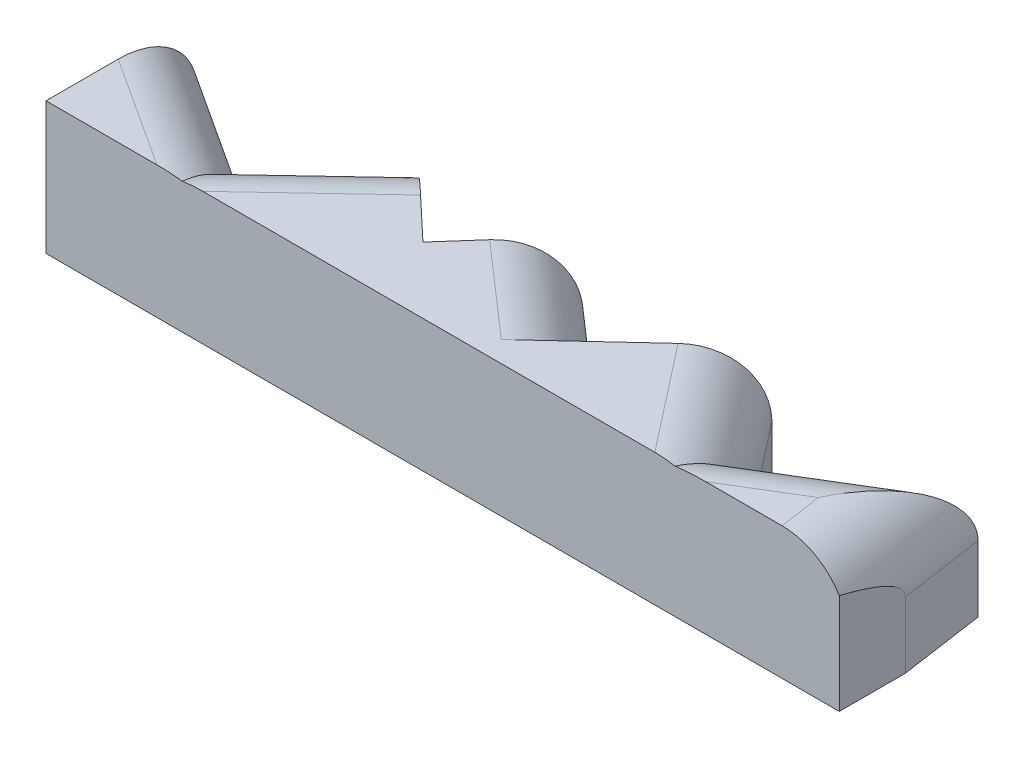
ISO-10303-21;
HEADER;
FILE_DESCRIPTION(('STEP AP214'),'2;1');
FILE_NAME('part.step','',(''),(''),'','','');
FILE_SCHEMA(('AUTOMOTIVE_DESIGN { 1 0 10303 214 1 1 1 1 }'));
ENDSEC;
DATA;
#1=APPLICATION_CONTEXT('core data for automotive mechanical design processes');
#2=APPLICATION_PROTOCOL_DEFINITION('international standard','automotive_design',2000,#1);
#3=PRODUCT_CONTEXT('',#1,'mechanical');
#4=PRODUCT('Part','Part','',(#3));
#5=PRODUCT_RELATED_PRODUCT_CATEGORY('part','',(#4));
#6=PRODUCT_DEFINITION_FORMATION('','',#4);
#7=PRODUCT_DEFINITION_CONTEXT('part definition',#1,'design');
#8=PRODUCT_DEFINITION('design','',#6,#7);
#9=PRODUCT_DEFINITION_SHAPE('','',#8);
#10=(LENGTH_UNIT() NAMED_UNIT(*) SI_UNIT(.MILLI.,.METRE.));
#11=(NAMED_UNIT(*) PLANE_ANGLE_UNIT() SI_UNIT($,.RADIAN.));
#12=(NAMED_UNIT(*) SI_UNIT($,.STERADIAN.) SOLID_ANGLE_UNIT());
#13=UNCERTAINTY_MEASURE_WITH_UNIT(LENGTH_MEASURE(1.E-05),#10,'distance_accuracy_value','');
#14=(GEOMETRIC_REPRESENTATION_CONTEXT(3) GLOBAL_UNCERTAINTY_ASSIGNED_CONTEXT((#13)) GLOBAL_UNIT_ASSIGNED_CONTEXT((#10,
#11,#12)) REPRESENTATION_CONTEXT('',''));
#15=CARTESIAN_POINT('',(0.,0.,0.));
#16=DIRECTION('',(0.,0.,1.));
#17=DIRECTION('',(1.,0.,0.));
#18=AXIS2_PLACEMENT_3D('',#15,#16,#17);
#19=CARTESIAN_POINT('',(0.,129.522150417628,0.));
#20=DIRECTION('',(0.,-1.,0.));
#21=DIRECTION('',(0.,0.,-1.));
#22=AXIS2_PLACEMENT_3D('',#19,#20,#21);
#23=PLANE('',#22);
#24=DIRECTION('',(1.,0.,0.));
#25=VECTOR('',#24,1.);
#26=CARTESIAN_POINT('',(-32.3481367773547,129.522150417628,19.2762862056775));
#27=LINE('',#26,#25);
#28=CARTESIAN_POINT('',(-32.3481367773547,129.522150417628,19.2762862056775));
#29=VERTEX_POINT('',#28);
#30=CARTESIAN_POINT('',(-11.0387420261043,129.522150417628,19.2762862056775));
#31=VERTEX_POINT('',#30);
#32=EDGE_CURVE('E240',#29,#31,#27,.T.);
#33=ORIENTED_EDGE('',*,*,#32,.T.);
#34=DIRECTION('',(-0.838034932453273,0.,-0.54561657964915));
#35=VECTOR('',#34,1.);
#36=CARTESIAN_POINT('',(-39.2774673388989,129.522150417628,0.890994468834512));
#37=LINE('',#36,#35);
#38=CARTESIAN_POINT('',(-32.3481367773547,129.522150417628,5.40245036862647));
#39=VERTEX_POINT('',#38);
#40=EDGE_CURVE('E267',#31,#39,#37,.T.);
#41=ORIENTED_EDGE('',*,*,#40,.T.);
#42=DIRECTION('',(0.,0.,1.));
#43=VECTOR('',#42,1.);
#44=CARTESIAN_POINT('',(-32.3481367773547,129.522150417628,19.2762862056775));
#45=LINE('',#44,#43);
#46=EDGE_CURVE('E185',#39,#29,#45,.T.);
#47=ORIENTED_EDGE('',*,*,#46,.T.);
#48=EDGE_LOOP('',(#33,#41,#47));
#49=FACE_BOUND('',#48,.T.);
#50=ADVANCED_FACE('F34',(#49),#23,.F.);
#51=CARTESIAN_POINT('',(94.3752872082478,129.522150417628,19.2762862056775));
#52=VERTEX_POINT('',#51);
#53=CARTESIAN_POINT('',(109.06426888178,129.522150417628,19.2762862056775));
#54=VERTEX_POINT('',#53);
#55=EDGE_CURVE('E244',#52,#54,#27,.T.);
#56=ORIENTED_EDGE('',*,*,#55,.T.);
#57=DIRECTION('',(-0.143830824403792,0.,-0.989602290797331));
#58=VECTOR('',#57,1.);
#59=CARTESIAN_POINT('',(105.110720412667,129.522150417628,-7.9253977033939));
#60=LINE('',#59,#58);
#61=CARTESIAN_POINT('',(107.871821895293,129.522150417628,11.0718677552231));
#62=VERTEX_POINT('',#61);
#63=EDGE_CURVE('E262',#54,#62,#60,.T.);
#64=ORIENTED_EDGE('',*,*,#63,.T.);
#65=DIRECTION('',(-0.854503886737945,0.,0.519444999542536));
#66=VECTOR('',#65,1.);
#67=CARTESIAN_POINT('',(97.414979242716,129.522150417628,17.4284855672494));
#68=LINE('',#67,#66);
#69=EDGE_CURVE('E260',#62,#52,#68,.T.);
#70=ORIENTED_EDGE('',*,*,#69,.T.);
#71=EDGE_LOOP('',(#56,#64,#70));
#72=FACE_BOUND('',#71,.T.);
#73=ADVANCED_FACE('F332',(#72),#23,.F.);
#74=CARTESIAN_POINT('',(-32.3481367773547,104.122150417628,247.876286205677));
#75=DIRECTION('',(0.,-1.,0.));
#76=DIRECTION('',(0.,0.,-1.));
#77=AXIS2_PLACEMENT_3D('',#74,#75,#76);
#78=PLANE('',#77);
#79=DIRECTION('',(1.,0.,0.));
#80=VECTOR('',#79,1.);
#81=CARTESIAN_POINT('',(-32.3481367773547,104.122150417628,19.2762862056775));
#82=LINE('',#81,#80);
#83=CARTESIAN_POINT('',(-32.3481367773547,104.122150417628,19.2762862056775));
#84=VERTEX_POINT('',#83);
#85=CARTESIAN_POINT('',(120.051863222645,104.122150417628,19.2762862056775));
#86=VERTEX_POINT('',#85);
#87=EDGE_CURVE('E171',#84,#86,#82,.T.);
#88=ORIENTED_EDGE('',*,*,#87,.F.);
#89=DIRECTION('',(0.,0.,1.));
#90=VECTOR('',#89,1.);
#91=CARTESIAN_POINT('',(-32.3481367773547,104.122150417628,19.2762862056775));
#92=LINE('',#91,#90);
#93=CARTESIAN_POINT('',(-32.3481367773547,104.122150417628,-9.75204917332207));
#94=VERTEX_POINT('',#93);
#95=EDGE_CURVE('E164',#94,#84,#92,.T.);
#96=ORIENTED_EDGE('',*,*,#95,.F.);
#97=DIRECTION('',(-0.838034932453273,0.,-0.54561657964915));
#98=VECTOR('',#97,1.);
#99=CARTESIAN_POINT('',(-32.3481367773547,104.122150417628,-9.75204917332206));
#100=LINE('',#99,#98);
#101=CARTESIAN_POINT('',(-7.26877528651925,104.122150417628,6.57628620567745));
#102=VERTEX_POINT('',#101);
#103=EDGE_CURVE('E168',#102,#94,#100,.T.);
#104=ORIENTED_EDGE('',*,*,#103,.F.);
#105=DIRECTION('',(-0.727757972532606,0.,0.685834042181657));
#106=VECTOR('',#105,1.);
#107=CARTESIAN_POINT('',(-7.26877528651926,104.122150417628,6.57628620567745));
#108=LINE('',#107,#106);
#109=CARTESIAN_POINT('',(10.0576849347505,104.122150417628,-9.75204917332206));
#110=VERTEX_POINT('',#109);
#111=EDGE_CURVE('E192',#110,#102,#108,.T.);
#112=ORIENTED_EDGE('',*,*,#111,.F.);
#113=DIRECTION('',(-0.727481315917903,0.,-0.686127491790233));
#114=VECTOR('',#113,1.);
#115=CARTESIAN_POINT('',(10.0576849347505,104.122150417628,-9.75204917332206));
#116=LINE('',#115,#114);
#117=CARTESIAN_POINT('',(27.3701509857318,104.122150417628,6.57628620567745));
#118=VERTEX_POINT('',#117);
#119=EDGE_CURVE('E200',#118,#110,#116,.T.);
#120=ORIENTED_EDGE('',*,*,#119,.F.);
#121=DIRECTION('',(-0.661958734624775,0.,0.749540281541938));
#122=VECTOR('',#121,1.);
#123=CARTESIAN_POINT('',(27.3701509857318,104.122150417628,6.57628620567745));
#124=LINE('',#123,#122);
#125=CARTESIAN_POINT('',(41.7905690635649,104.122150417628,-9.75204917332207));
#126=VERTEX_POINT('',#125);
#127=EDGE_CURVE('E204',#126,#118,#124,.T.);
#128=ORIENTED_EDGE('',*,*,#127,.F.);
#129=DIRECTION('',(-0.752940248667759,0.,-0.658088886045141));
#130=VECTOR('',#129,1.);
#131=CARTESIAN_POINT('',(41.7905690635649,104.122150417628,-9.75204917332206));
#132=LINE('',#131,#130);
#133=CARTESIAN_POINT('',(60.4723325172501,104.122150417628,6.57628620567745));
#134=VERTEX_POINT('',#133);
#135=EDGE_CURVE('E208',#134,#126,#132,.T.);
#136=ORIENTED_EDGE('',*,*,#135,.F.);
#137=DIRECTION('',(-0.73322275073973,0.,0.679988527695625));
#138=VECTOR('',#137,1.);
#139=CARTESIAN_POINT('',(60.47233251725,104.122150417628,6.57628620567745));
#140=LINE('',#139,#138);
#141=CARTESIAN_POINT('',(78.0789633558072,104.122150417628,-9.75204917332206));
#142=VERTEX_POINT('',#141);
#143=EDGE_CURVE('E212',#142,#134,#140,.T.);
#144=ORIENTED_EDGE('',*,*,#143,.F.);
#145=DIRECTION('',(-0.61512074165381,0.,-0.788432922439992));
#146=VECTOR('',#145,1.);
#147=CARTESIAN_POINT('',(78.0789633558072,104.122150417628,-9.75204917332206));
#148=LINE('',#147,#146);
#149=CARTESIAN_POINT('',(90.8180277485258,104.122150417628,6.57628620567745));
#150=VERTEX_POINT('',#149);
#151=EDGE_CURVE('E216',#150,#142,#148,.T.);
#152=ORIENTED_EDGE('',*,*,#151,.F.);
#153=DIRECTION('',(-0.854503886737945,0.,0.519444999542536));
#154=VECTOR('',#153,1.);
#155=CARTESIAN_POINT('',(90.8180277485258,104.122150417628,6.57628620567745));
#156=LINE('',#155,#154);
#157=CARTESIAN_POINT('',(117.678669505793,104.122150417628,-9.75204917332206));
#158=VERTEX_POINT('',#157);
#159=EDGE_CURVE('E220',#158,#150,#156,.T.);
#160=ORIENTED_EDGE('',*,*,#159,.F.);
#161=DIRECTION('',(-0.143830824403792,0.,-0.989602290797331));
#162=VECTOR('',#161,1.);
#163=CARTESIAN_POINT('',(117.678669505793,104.122150417628,-9.75204917332206));
#164=LINE('',#163,#162);
#165=CARTESIAN_POINT('',(120.051863222645,104.122150417628,6.57628620567745));
#166=VERTEX_POINT('',#165);
#167=EDGE_CURVE('E224',#166,#158,#164,.T.);
#168=ORIENTED_EDGE('',*,*,#167,.F.);
#169=DIRECTION('',(0.,0.,-1.));
#170=VECTOR('',#169,1.);
#171=CARTESIAN_POINT('',(120.051863222645,104.122150417628,19.2762862056775));
#172=LINE('',#171,#170);
#173=EDGE_CURVE('E248',#86,#166,#172,.T.);
#174=ORIENTED_EDGE('',*,*,#173,.F.);
#175=EDGE_LOOP('',(#88,#96,#104,#112,#120,#128,#136,#144,#152,#160,#168,#174));
#176=FACE_BOUND('',#175,.T.);
#177=ADVANCED_FACE('F166',(#176),#78,.T.);
#178=DIRECTION('',(-0.727481315917903,0.,-0.686127491790233));
#179=VECTOR('',#178,1.);
#180=CARTESIAN_POINT('',(10.0576849347505,129.522150417628,-9.75204917332206));
#181=LINE('',#180,#179);
#182=CARTESIAN_POINT('',(27.3701509857318,129.522150417628,6.57628620567745));
#183=VERTEX_POINT('',#182);
#184=CARTESIAN_POINT('',(19.3127440329091,129.522150417628,-1.0230958016775));
#185=VERTEX_POINT('',#184);
#186=EDGE_CURVE('E226',#183,#185,#181,.T.);
#187=ORIENTED_EDGE('',*,*,#186,.T.);
#188=DIRECTION('',(-0.727757972532606,0.,0.685834042181657));
#189=VECTOR('',#188,1.);
#190=CARTESIAN_POINT('',(1.44131704918779,129.522150417628,15.8188124568415));
#191=LINE('',#190,#189);
#192=CARTESIAN_POINT('',(-2.22750650108892,129.522150417628,19.2762862056775));
#193=VERTEX_POINT('',#192);
#194=EDGE_CURVE('E265',#185,#193,#191,.T.);
#195=ORIENTED_EDGE('',*,*,#194,.T.);
#196=CARTESIAN_POINT('',(84.6184304944313,129.522150417628,19.2762862056775));
#197=VERTEX_POINT('',#196);
#198=EDGE_CURVE('E243',#193,#197,#27,.T.);
#199=ORIENTED_EDGE('',*,*,#198,.T.);
#200=DIRECTION('',(-0.61512074165381,0.,-0.788432922439992));
#201=VECTOR('',#200,1.);
#202=CARTESIAN_POINT('',(68.0658652408193,129.522150417628,-1.94001575431866));
#203=LINE('',#202,#201);
#204=CARTESIAN_POINT('',(68.7331277638799,129.522150417628,-1.08474994150127));
#205=VERTEX_POINT('',#204);
#206=EDGE_CURVE('E258',#197,#205,#203,.T.);
#207=ORIENTED_EDGE('',*,*,#206,.T.);
#208=DIRECTION('',(-0.73322275073973,0.,0.679988527695625));
#209=VECTOR('',#208,1.);
#210=CARTESIAN_POINT('',(60.47233251725,129.522150417628,6.57628620567745));
#211=LINE('',#210,#209);
#212=CARTESIAN_POINT('',(51.109059837337,129.522150417628,15.2597565393561));
#213=VERTEX_POINT('',#212);
#214=EDGE_CURVE('E196',#205,#213,#211,.T.);
#215=ORIENTED_EDGE('',*,*,#214,.T.);
#216=DIRECTION('',(-0.752940248667759,0.,-0.658088886045141));
#217=VECTOR('',#216,1.);
#218=CARTESIAN_POINT('',(33.4328402107916,129.522150417628,-0.18970801524153));
#219=LINE('',#218,#217);
#220=CARTESIAN_POINT('',(33.3835815920034,129.522150417628,-0.232761298186398));
#221=VERTEX_POINT('',#220);
#222=EDGE_CURVE('E255',#213,#221,#219,.T.);
#223=ORIENTED_EDGE('',*,*,#222,.T.);
#224=DIRECTION('',(-0.661958734624775,0.,0.749540281541938));
#225=VECTOR('',#224,1.);
#226=CARTESIAN_POINT('',(27.3701509857318,129.522150417628,6.57628620567745));
#227=LINE('',#226,#225);
#228=EDGE_CURVE('E354',#221,#183,#227,.T.);
#229=ORIENTED_EDGE('',*,*,#228,.T.);
#230=EDGE_LOOP('',(#187,#195,#199,#207,#215,#223,#229));
#231=FACE_BOUND('',#230,.T.);
#232=ADVANCED_FACE('F327',(#231),#23,.F.);
#233=CARTESIAN_POINT('',(-32.3481367773547,-48.8061007330347,19.2762862056775));
#234=DIRECTION('',(0.,0.,1.));
#235=DIRECTION('',(1.,0.,0.));
#236=AXIS2_PLACEMENT_3D('',#233,#234,#235);
#237=PLANE('',#236);
#238=CARTESIAN_POINT('',(-2.22750650108891,116.822150417628,19.2762862056775));
#239=DIRECTION('',(0.,0.,1.));
#240=DIRECTION('',(1.,0.,0.));
#241=AXIS2_PLACEMENT_3D('',#238,#239,#240);
#242=ELLIPSE('',#241,18.5175993300084,12.7);
#243=CARTESIAN_POINT('',(-6.1314845448813,129.236702172233,19.2762862056775));
#244=VERTEX_POINT('',#243);
#245=EDGE_CURVE('E279',#193,#244,#242,.T.);
#246=ORIENTED_EDGE('',*,*,#245,.T.);
#247=CARTESIAN_POINT('',(-11.0387420261043,116.822150417628,19.2762862056775));
#248=DIRECTION('',(0.,0.,1.));
#249=DIRECTION('',(1.,0.,0.));
#250=AXIS2_PLACEMENT_3D('',#247,#248,#249);
#251=ELLIPSE('',#250,23.2764187777551,12.7);
#252=EDGE_CURVE('E281',#244,#31,#251,.T.);
#253=ORIENTED_EDGE('',*,*,#252,.T.);
#254=ORIENTED_EDGE('',*,*,#32,.F.);
#255=DIRECTION('',(0.,1.,0.));
#256=VECTOR('',#255,1.);
#257=CARTESIAN_POINT('',(-32.3481367773547,-48.8061007330347,19.2762862056775));
#258=LINE('',#257,#256);
#259=EDGE_CURVE('E175',#84,#29,#258,.T.);
#260=ORIENTED_EDGE('',*,*,#259,.F.);
#261=ORIENTED_EDGE('',*,*,#87,.T.);
#262=DIRECTION('',(0.,1.,0.));
#263=VECTOR('',#262,1.);
#264=CARTESIAN_POINT('',(120.051863222645,-48.8061007330347,19.2762862056775));
#265=LINE('',#264,#263);
#266=CARTESIAN_POINT('',(120.051863222645,123.384184533935,19.2762862056775));
#267=VERTEX_POINT('',#266);
#268=EDGE_CURVE('E246',#86,#267,#265,.T.);
#269=ORIENTED_EDGE('',*,*,#268,.T.);
#270=CARTESIAN_POINT('',(109.06426888178,116.822150417628,19.2762862056774));
#271=DIRECTION('',(0.,0.,1.));
#272=DIRECTION('',(1.,0.,0.));
#273=AXIS2_PLACEMENT_3D('',#270,#271,#272);
#274=ELLIPSE('',#273,12.8334383601391,12.7);
#275=EDGE_CURVE('E277',#267,#54,#274,.T.);
#276=ORIENTED_EDGE('',*,*,#275,.T.);
#277=ORIENTED_EDGE('',*,*,#55,.F.);
#278=CARTESIAN_POINT('',(94.375287208248,116.822150417628,19.2762862056775));
#279=DIRECTION('',(0.,0.,1.));
#280=DIRECTION('',(1.,0.,0.));
#281=AXIS2_PLACEMENT_3D('',#278,#279,#280);
#282=ELLIPSE('',#281,24.4491717336477,12.7);
#283=CARTESIAN_POINT('',(88.4935249096369,129.149170946848,19.2762862056775));
#284=VERTEX_POINT('',#283);
#285=EDGE_CURVE('E275',#52,#284,#282,.T.);
#286=ORIENTED_EDGE('',*,*,#285,.T.);
#287=CARTESIAN_POINT('',(84.6184304944313,116.822150417628,19.2762862056775));
#288=DIRECTION('',(0.,0.,1.));
#289=DIRECTION('',(1.,0.,0.));
#290=AXIS2_PLACEMENT_3D('',#287,#288,#289);
#291=ELLIPSE('',#290,16.1079016851514,12.7);
#292=EDGE_CURVE('E273',#284,#197,#291,.T.);
#293=ORIENTED_EDGE('',*,*,#292,.T.);
#294=ORIENTED_EDGE('',*,*,#198,.F.);
#295=EDGE_LOOP('',(#246,#253,#254,#260,#261,#269,#276,#277,#286,#293,#294));
#296=FACE_BOUND('',#295,.T.);
#297=ADVANCED_FACE('F322',(#296),#237,.T.);
#298=CARTESIAN_POINT('',(120.051863222645,-48.8061007330347,19.2762862056775));
#299=DIRECTION('',(1.,0.,0.));
#300=DIRECTION('',(0.,0.,-1.));
#301=AXIS2_PLACEMENT_3D('',#298,#299,#300);
#302=PLANE('',#301);
#303=DIRECTION('',(0.,1.,0.));
#304=VECTOR('',#303,1.);
#305=CARTESIAN_POINT('',(120.051863222645,-48.8061007330347,6.57628620567745));
#306=LINE('',#305,#304);
#307=CARTESIAN_POINT('',(120.051863222645,116.822150417627,6.57628620567745));
#308=VERTEX_POINT('',#307);
#309=EDGE_CURVE('E176',#166,#308,#306,.T.);
#310=ORIENTED_EDGE('',*,*,#309,.T.);
#311=CARTESIAN_POINT('',(120.051863222645,116.822150417628,94.8744660474745));
#312=DIRECTION('',(1.,0.,0.));
#313=DIRECTION('',(0.,0.,1.));
#314=AXIS2_PLACEMENT_3D('',#311,#312,#313);
#315=ELLIPSE('',#314,88.298179841797,12.7);
#316=EDGE_CURVE('E289',#308,#267,#315,.T.);
#317=ORIENTED_EDGE('',*,*,#316,.T.);
#318=ORIENTED_EDGE('',*,*,#268,.F.);
#319=ORIENTED_EDGE('',*,*,#173,.T.);
#320=EDGE_LOOP('',(#310,#317,#318,#319));
#321=FACE_BOUND('',#320,.T.);
#322=ADVANCED_FACE('F338',(#321),#302,.T.);
#323=CARTESIAN_POINT('',(-32.3481367773547,-48.8061007330347,19.2762862056775));
#324=DIRECTION('',(-1.,0.,0.));
#325=DIRECTION('',(0.,0.,1.));
#326=AXIS2_PLACEMENT_3D('',#323,#324,#325);
#327=PLANE('',#326);
#328=ORIENTED_EDGE('',*,*,#46,.F.);
#329=CARTESIAN_POINT('',(-32.3481367773547,116.822150417628,5.40245036862647));
#330=DIRECTION('',(-1.,0.,0.));
#331=DIRECTION('',(0.,0.,1.));
#332=AXIS2_PLACEMENT_3D('',#329,#330,#331);
#333=ELLIPSE('',#332,15.1544995419485,12.7);
#334=CARTESIAN_POINT('',(-32.3481367773547,116.822150417627,-9.75204917332206));
#335=VERTEX_POINT('',#334);
#336=EDGE_CURVE('E182',#39,#335,#333,.T.);
#337=ORIENTED_EDGE('',*,*,#336,.T.);
#338=DIRECTION('',(0.,1.,0.));
#339=VECTOR('',#338,1.);
#340=CARTESIAN_POINT('',(-32.3481367773547,-49.6171317000607,-9.75204917332206));
#341=LINE('',#340,#339);
#342=EDGE_CURVE('E179',#94,#335,#341,.T.);
#343=ORIENTED_EDGE('',*,*,#342,.F.);
#344=ORIENTED_EDGE('',*,*,#95,.T.);
#345=ORIENTED_EDGE('',*,*,#259,.T.);
#346=EDGE_LOOP('',(#328,#337,#343,#344,#345));
#347=FACE_BOUND('',#346,.T.);
#348=ADVANCED_FACE('F181',(#347),#327,.T.);
#349=CARTESIAN_POINT('',(117.678669505793,-49.6171317000607,-9.75204917332206));
#350=DIRECTION('',(0.989602290797331,0.,-0.143830824403792));
#351=DIRECTION('',(-0.143830824403792,0.,-0.989602290797331));
#352=AXIS2_PLACEMENT_3D('',#349,#350,#351);
#353=PLANE('',#352);
#354=DIRECTION('',(0.,1.,0.));
#355=VECTOR('',#354,1.);
#356=CARTESIAN_POINT('',(117.678669505793,-49.6171317000607,-9.75204917332206));
#357=LINE('',#356,#355);
#358=CARTESIAN_POINT('',(117.678669505793,116.822150417627,-9.75204917332206));
#359=VERTEX_POINT('',#358);
#360=EDGE_CURVE('E223',#158,#359,#357,.T.);
#361=ORIENTED_EDGE('',*,*,#360,.T.);
#362=DIRECTION('',(-0.143830824403792,0.,-0.989602290797331));
#363=VECTOR('',#362,1.);
#364=CARTESIAN_POINT('',(120.051863222645,116.822150417628,6.57628620567746));
#365=LINE('',#364,#363);
#366=EDGE_CURVE('E287',#359,#308,#365,.F.);
#367=ORIENTED_EDGE('',*,*,#366,.T.);
#368=ORIENTED_EDGE('',*,*,#309,.F.);
#369=ORIENTED_EDGE('',*,*,#167,.T.);
#370=EDGE_LOOP('',(#361,#367,#368,#369));
#371=FACE_BOUND('',#370,.T.);
#372=ADVANCED_FACE('F342',(#371),#353,.T.);
#373=CARTESIAN_POINT('',(90.8180277485258,-49.6171317000607,6.57628620567745));
#374=DIRECTION('',(-0.519444999542536,0.,-0.854503886737945));
#375=DIRECTION('',(-0.854503886737945,0.,0.519444999542536));
#376=AXIS2_PLACEMENT_3D('',#373,#374,#375);
#377=PLANE('',#376);
#378=DIRECTION('',(0.,1.,0.));
#379=VECTOR('',#378,1.);
#380=CARTESIAN_POINT('',(90.8180277485258,-49.6171317000607,6.57628620567745));
#381=LINE('',#380,#379);
#382=CARTESIAN_POINT('',(90.8180277485258,116.822150417627,6.57628620567745));
#383=VERTEX_POINT('',#382);
#384=EDGE_CURVE('E219',#150,#383,#381,.T.);
#385=ORIENTED_EDGE('',*,*,#384,.T.);
#386=DIRECTION('',(-0.854503886737945,0.,0.519444999542536));
#387=VECTOR('',#386,1.);
#388=CARTESIAN_POINT('',(117.678669505793,116.822150417628,-9.75204917332207));
#389=LINE('',#388,#387);
#390=EDGE_CURVE('E291',#383,#359,#389,.F.);
#391=ORIENTED_EDGE('',*,*,#390,.T.);
#392=ORIENTED_EDGE('',*,*,#360,.F.);
#393=ORIENTED_EDGE('',*,*,#159,.T.);
#394=EDGE_LOOP('',(#385,#391,#392,#393));
#395=FACE_BOUND('',#394,.T.);
#396=ADVANCED_FACE('F345',(#395),#377,.T.);
#397=CARTESIAN_POINT('',(78.0789633558072,-49.6171317000607,-9.75204917332206));
#398=DIRECTION('',(0.788432922439992,0.,-0.61512074165381));
#399=DIRECTION('',(-0.61512074165381,0.,-0.788432922439992));
#400=AXIS2_PLACEMENT_3D('',#397,#398,#399);
#401=PLANE('',#400);
#402=DIRECTION('',(0.,1.,0.));
#403=VECTOR('',#402,1.);
#404=CARTESIAN_POINT('',(78.0789633558072,-49.6171317000607,-9.75204917332206));
#405=LINE('',#404,#403);
#406=CARTESIAN_POINT('',(78.0789633558072,116.822150417627,-9.75204917332206));
#407=VERTEX_POINT('',#406);
#408=EDGE_CURVE('E215',#142,#407,#405,.T.);
#409=ORIENTED_EDGE('',*,*,#408,.T.);
#410=DIRECTION('',(-0.61512074165381,0.,-0.788432922439992));
#411=VECTOR('',#410,1.);
#412=CARTESIAN_POINT('',(90.8180277485258,116.822150417628,6.57628620567745));
#413=LINE('',#412,#411);
#414=EDGE_CURVE('E295',#407,#383,#413,.F.);
#415=ORIENTED_EDGE('',*,*,#414,.T.);
#416=ORIENTED_EDGE('',*,*,#384,.F.);
#417=ORIENTED_EDGE('',*,*,#151,.T.);
#418=EDGE_LOOP('',(#409,#415,#416,#417));
#419=FACE_BOUND('',#418,.T.);
#420=ADVANCED_FACE('F348',(#419),#401,.T.);
#421=CARTESIAN_POINT('',(60.47233251725,-49.6171317000607,6.57628620567745));
#422=DIRECTION('',(-0.679988527695625,0.,-0.73322275073973));
#423=DIRECTION('',(-0.73322275073973,0.,0.679988527695625));
#424=AXIS2_PLACEMENT_3D('',#421,#422,#423);
#425=PLANE('',#424);
#426=ORIENTED_EDGE('',*,*,#214,.F.);
#427=CARTESIAN_POINT('',(68.73312776388,116.822150417628,-1.08474994150128));
#428=DIRECTION('',(-0.679988527695625,0.,-0.73322275073973));
#429=DIRECTION('',(-0.73322275073973,0.,0.679988527695625));
#430=AXIS2_PLACEMENT_3D('',#427,#428,#429);
#431=ELLIPSE('',#430,12.7462433244174,12.7);
#432=EDGE_CURVE('E293',#205,#407,#431,.T.);
#433=ORIENTED_EDGE('',*,*,#432,.T.);
#434=ORIENTED_EDGE('',*,*,#408,.F.);
#435=ORIENTED_EDGE('',*,*,#143,.T.);
#436=DIRECTION('',(0.,1.,0.));
#437=VECTOR('',#436,1.);
#438=CARTESIAN_POINT('',(60.47233251725,-49.6171317000607,6.57628620567745));
#439=LINE('',#438,#437);
#440=CARTESIAN_POINT('',(60.47233251725,116.822150417627,6.57628620567745));
#441=VERTEX_POINT('',#440);
#442=EDGE_CURVE('E211',#134,#441,#439,.T.);
#443=ORIENTED_EDGE('',*,*,#442,.T.);
#444=CARTESIAN_POINT('',(51.109059837337,116.822150417628,15.2597565393561));
#445=DIRECTION('',(-0.679988527695625,0.,-0.73322275073973));
#446=DIRECTION('',(0.73322275073973,0.,-0.679988527695625));
#447=AXIS2_PLACEMENT_3D('',#444,#445,#446);
#448=ELLIPSE('',#447,12.7700247577788,12.7);
#449=EDGE_CURVE('E11',#441,#213,#448,.F.);
#450=ORIENTED_EDGE('',*,*,#449,.T.);
#451=EDGE_LOOP('',(#426,#433,#434,#435,#443,#450));
#452=FACE_BOUND('',#451,.T.);
#453=ADVANCED_FACE('F351',(#452),#425,.T.);
#454=CARTESIAN_POINT('',(41.7905690635649,-49.6171317000607,-9.75204917332206));
#455=DIRECTION('',(0.658088886045141,0.,-0.752940248667759));
#456=DIRECTION('',(-0.752940248667759,0.,-0.658088886045141));
#457=AXIS2_PLACEMENT_3D('',#454,#455,#456);
#458=PLANE('',#457);
#459=DIRECTION('',(0.,1.,0.));
#460=VECTOR('',#459,1.);
#461=CARTESIAN_POINT('',(41.7905690635649,-49.6171317000607,-9.75204917332206));
#462=LINE('',#461,#460);
#463=CARTESIAN_POINT('',(41.7905690635649,116.822150417627,-9.75204917332206));
#464=VERTEX_POINT('',#463);
#465=EDGE_CURVE('E207',#126,#464,#462,.T.);
#466=ORIENTED_EDGE('',*,*,#465,.T.);
#467=DIRECTION('',(-0.752940248667759,0.,-0.658088886045141));
#468=VECTOR('',#467,1.);
#469=CARTESIAN_POINT('',(60.47233251725,116.822150417628,6.57628620567744));
#470=LINE('',#469,#468);
#471=EDGE_CURVE('E43',#464,#441,#470,.F.);
#472=ORIENTED_EDGE('',*,*,#471,.T.);
#473=ORIENTED_EDGE('',*,*,#442,.F.);
#474=ORIENTED_EDGE('',*,*,#135,.T.);
#475=EDGE_LOOP('',(#466,#472,#473,#474));
#476=FACE_BOUND('',#475,.T.);
#477=ADVANCED_FACE('F375',(#476),#458,.T.);
#478=CARTESIAN_POINT('',(27.3701509857318,-49.6171317000607,6.57628620567745));
#479=DIRECTION('',(-0.749540281541938,0.,-0.661958734624775));
#480=DIRECTION('',(-0.661958734624775,0.,0.749540281541938));
#481=AXIS2_PLACEMENT_3D('',#478,#479,#480);
#482=PLANE('',#481);
#483=ORIENTED_EDGE('',*,*,#228,.F.);
#484=CARTESIAN_POINT('',(33.3835815920034,116.822150417628,-0.232761298186404));
#485=DIRECTION('',(-0.749540281541938,0.,-0.661958734624775));
#486=DIRECTION('',(0.661958734624775,0.,-0.749540281541938));
#487=AXIS2_PLACEMENT_3D('',#484,#485,#486);
#488=ELLIPSE('',#487,12.7001685026891,12.7);
#489=EDGE_CURVE('E51',#221,#464,#488,.T.);
#490=ORIENTED_EDGE('',*,*,#489,.T.);
#491=ORIENTED_EDGE('',*,*,#465,.F.);
#492=ORIENTED_EDGE('',*,*,#127,.T.);
#493=DIRECTION('',(0.,1.,0.));
#494=VECTOR('',#493,1.);
#495=CARTESIAN_POINT('',(27.3701509857318,-49.6171317000607,6.57628620567745));
#496=LINE('',#495,#494);
#497=EDGE_CURVE('E203',#118,#183,#496,.T.);
#498=ORIENTED_EDGE('',*,*,#497,.T.);
#499=EDGE_LOOP('',(#483,#490,#491,#492,#498));
#500=FACE_BOUND('',#499,.T.);
#501=ADVANCED_FACE('F374',(#500),#482,.T.);
#502=CARTESIAN_POINT('',(10.0576849347505,-49.6171317000607,-9.75204917332206));
#503=DIRECTION('',(0.686127491790233,0.,-0.727481315917903));
#504=DIRECTION('',(-0.727481315917903,0.,-0.686127491790233));
#505=AXIS2_PLACEMENT_3D('',#502,#503,#504);
#506=PLANE('',#505);
#507=DIRECTION('',(0.,1.,0.));
#508=VECTOR('',#507,1.);
#509=CARTESIAN_POINT('',(10.0576849347505,-49.6171317000607,-9.75204917332206));
#510=LINE('',#509,#508);
#511=CARTESIAN_POINT('',(10.0576849347505,116.822150417627,-9.75204917332206));
#512=VERTEX_POINT('',#511);
#513=EDGE_CURVE('E199',#110,#512,#510,.T.);
#514=ORIENTED_EDGE('',*,*,#513,.T.);
#515=CARTESIAN_POINT('',(19.3127440329091,116.822150417628,-1.0230958016775));
#516=DIRECTION('',(0.686127491790233,0.,-0.727481315917903));
#517=DIRECTION('',(0.727481315917903,0.,0.686127491790233));
#518=AXIS2_PLACEMENT_3D('',#515,#516,#517);
#519=ELLIPSE('',#518,12.7220574544668,12.7);
#520=EDGE_CURVE('E285',#512,#185,#519,.T.);
#521=ORIENTED_EDGE('',*,*,#520,.T.);
#522=ORIENTED_EDGE('',*,*,#186,.F.);
#523=ORIENTED_EDGE('',*,*,#497,.F.);
#524=ORIENTED_EDGE('',*,*,#119,.T.);
#525=EDGE_LOOP('',(#514,#521,#522,#523,#524));
#526=FACE_BOUND('',#525,.T.);
#527=ADVANCED_FACE('F373',(#526),#506,.T.);
#528=CARTESIAN_POINT('',(-7.26877528651926,-49.6171317000607,6.57628620567745));
#529=DIRECTION('',(-0.685834042181657,0.,-0.727757972532606));
#530=DIRECTION('',(-0.727757972532606,0.,0.685834042181657));
#531=AXIS2_PLACEMENT_3D('',#528,#529,#530);
#532=PLANE('',#531);
#533=DIRECTION('',(0.,1.,0.));
#534=VECTOR('',#533,1.);
#535=CARTESIAN_POINT('',(-7.26877528651926,-49.6171317000607,6.57628620567745));
#536=LINE('',#535,#534);
#537=CARTESIAN_POINT('',(-7.26877528651926,116.822150417627,6.57628620567745));
#538=VERTEX_POINT('',#537);
#539=EDGE_CURVE('E189',#102,#538,#536,.T.);
#540=ORIENTED_EDGE('',*,*,#539,.T.);
#541=DIRECTION('',(-0.727757972532606,0.,0.685834042181657));
#542=VECTOR('',#541,1.);
#543=CARTESIAN_POINT('',(10.0576849347505,116.822150417628,-9.75204917332207));
#544=LINE('',#543,#542);
#545=EDGE_CURVE('E283',#538,#512,#544,.F.);
#546=ORIENTED_EDGE('',*,*,#545,.T.);
#547=ORIENTED_EDGE('',*,*,#513,.F.);
#548=ORIENTED_EDGE('',*,*,#111,.T.);
#549=EDGE_LOOP('',(#540,#546,#547,#548));
#550=FACE_BOUND('',#549,.T.);
#551=ADVANCED_FACE('F371',(#550),#532,.T.);
#552=CARTESIAN_POINT('',(-32.3481367773547,-49.6171317000607,-9.75204917332206));
#553=DIRECTION('',(0.54561657964915,0.,-0.838034932453273));
#554=DIRECTION('',(-0.838034932453273,0.,-0.54561657964915));
#555=AXIS2_PLACEMENT_3D('',#552,#553,#554);
#556=PLANE('',#555);
#557=ORIENTED_EDGE('',*,*,#342,.T.);
#558=DIRECTION('',(-0.838034932453273,0.,-0.54561657964915));
#559=VECTOR('',#558,1.);
#560=CARTESIAN_POINT('',(-7.26877528651926,116.822150417628,6.57628620567745));
#561=LINE('',#560,#559);
#562=EDGE_CURVE('E271',#335,#538,#561,.F.);
#563=ORIENTED_EDGE('',*,*,#562,.T.);
#564=ORIENTED_EDGE('',*,*,#539,.F.);
#565=ORIENTED_EDGE('',*,*,#103,.T.);
#566=EDGE_LOOP('',(#557,#563,#564,#565));
#567=FACE_BOUND('',#566,.T.);
#568=ADVANCED_FACE('F187',(#567),#556,.T.);
#569=CARTESIAN_POINT('',(8.57345442833826,116.822150417628,9.09753588859549));
#570=DIRECTION('',(0.727757972532606,0.,-0.685834042181657));
#571=DIRECTION('',(-0.685834042181657,0.,-0.727757972532606));
#572=AXIS2_PLACEMENT_3D('',#569,#570,#571);
#573=CYLINDRICAL_SURFACE('',#572,12.7);
#574=ORIENTED_EDGE('',*,*,#520,.F.);
#575=ORIENTED_EDGE('',*,*,#545,.F.);
#576=CARTESIAN_POINT('',(-5.82766128315829,116.822150417628,22.6690469858497));
#577=DIRECTION('',(0.996014314067775,0.,-0.0891935321203276));
#578=DIRECTION('',(-0.0891935321203276,0.,-0.996014314067775));
#579=AXIS2_PLACEMENT_3D('',#576,#577,#578);
#580=ELLIPSE('',#579,16.1571581380678,12.7);
#581=EDGE_CURVE('E299',#244,#538,#580,.F.);
#582=ORIENTED_EDGE('',*,*,#581,.F.);
#583=ORIENTED_EDGE('',*,*,#245,.F.);
#584=ORIENTED_EDGE('',*,*,#194,.F.);
#585=EDGE_LOOP('',(#574,#575,#582,#583,#584));
#586=FACE_BOUND('',#585,.T.);
#587=ADVANCED_FACE('F361',(#586),#573,.T.);
#588=CARTESIAN_POINT('',(-12.1002053845749,116.822150417628,18.5852028335605));
#589=DIRECTION('',(0.838034932453273,0.,0.54561657964915));
#590=DIRECTION('',(0.54561657964915,0.,-0.838034932453273));
#591=AXIS2_PLACEMENT_3D('',#588,#589,#590);
#592=CYLINDRICAL_SURFACE('',#591,12.7);
#593=ORIENTED_EDGE('',*,*,#581,.T.);
#594=ORIENTED_EDGE('',*,*,#562,.F.);
#595=ORIENTED_EDGE('',*,*,#336,.F.);
#596=ORIENTED_EDGE('',*,*,#40,.F.);
#597=ORIENTED_EDGE('',*,*,#252,.F.);
#598=EDGE_LOOP('',(#593,#594,#595,#596,#597));
#599=FACE_BOUND('',#598,.T.);
#600=ADVANCED_FACE('F369',(#599),#592,.T.);
#601=CARTESIAN_POINT('',(43.2524153959939,116.822150417628,-33.7447322143342));
#602=DIRECTION('',(0.61512074165381,0.,0.788432922439992));
#603=DIRECTION('',(0.788432922439992,0.,-0.61512074165381));
#604=AXIS2_PLACEMENT_3D('',#601,#602,#603);
#605=CYLINDRICAL_SURFACE('',#604,12.7);
#606=ORIENTED_EDGE('',*,*,#206,.F.);
#607=ORIENTED_EDGE('',*,*,#292,.F.);
#608=CARTESIAN_POINT('',(87.7571716122839,116.822150417628,23.2993773888452));
#609=DIRECTION('',(0.983659139029489,0.,0.180040823714415));
#610=DIRECTION('',(-0.180040823714415,0.,0.983659139029489));
#611=AXIS2_PLACEMENT_3D('',#608,#609,#610);
#612=ELLIPSE('',#611,17.0009005351867,12.7);
#613=EDGE_CURVE('E38',#383,#284,#612,.T.);
#614=ORIENTED_EDGE('',*,*,#613,.F.);
#615=ORIENTED_EDGE('',*,*,#414,.F.);
#616=ORIENTED_EDGE('',*,*,#432,.F.);
#617=EDGE_LOOP('',(#606,#607,#614,#615,#616));
#618=FACE_BOUND('',#617,.T.);
#619=ADVANCED_FACE('F317',(#618),#605,.T.);
#620=CARTESIAN_POINT('',(34.0207554627748,116.822150417628,55.9652471355086));
#621=DIRECTION('',(0.854503886737945,0.,-0.519444999542536));
#622=DIRECTION('',(-0.519444999542536,0.,-0.854503886737945));
#623=AXIS2_PLACEMENT_3D('',#620,#621,#622);
#624=CYLINDRICAL_SURFACE('',#623,12.7);
#625=ORIENTED_EDGE('',*,*,#285,.F.);
#626=ORIENTED_EDGE('',*,*,#69,.F.);
#627=CARTESIAN_POINT('',(107.871821895293,116.822150417628,11.0718677552231));
#628=DIRECTION('',(0.904695517833563,0.,0.4260587048892));
#629=DIRECTION('',(0.4260587048892,0.,-0.904695517833563));
#630=AXIS2_PLACEMENT_3D('',#627,#628,#629);
#631=ELLIPSE('',#630,23.0175971009687,12.7);
#632=EDGE_CURVE('E301',#359,#62,#631,.T.);
#633=ORIENTED_EDGE('',*,*,#632,.F.);
#634=ORIENTED_EDGE('',*,*,#390,.F.);
#635=ORIENTED_EDGE('',*,*,#613,.T.);
#636=EDGE_LOOP('',(#625,#626,#633,#634,#635));
#637=FACE_BOUND('',#636,.T.);
#638=ADVANCED_FACE('F312',(#637),#624,.T.);
#639=CARTESIAN_POINT('',(104.06432673577,116.822150417628,-15.1249224507876));
#640=DIRECTION('',(0.143830824403792,0.,0.989602290797331));
#641=DIRECTION('',(0.989602290797331,0.,-0.143830824403792));
#642=AXIS2_PLACEMENT_3D('',#639,#640,#641);
#643=CYLINDRICAL_SURFACE('',#642,12.7);
#644=ORIENTED_EDGE('',*,*,#316,.F.);
#645=ORIENTED_EDGE('',*,*,#366,.F.);
#646=ORIENTED_EDGE('',*,*,#632,.T.);
#647=ORIENTED_EDGE('',*,*,#63,.F.);
#648=ORIENTED_EDGE('',*,*,#275,.F.);
#649=EDGE_LOOP('',(#644,#645,#646,#647,#648));
#650=FACE_BOUND('',#649,.T.);
#651=ADVANCED_FACE('F335',(#650),#643,.T.);
#652=CARTESIAN_POINT('',(14.5731278942916,116.822150417628,-16.6735752164675));
#653=DIRECTION('',(0.752940248667759,0.,0.658088886045141));
#654=DIRECTION('',(0.658088886045141,0.,-0.752940248667759));
#655=AXIS2_PLACEMENT_3D('',#652,#653,#654);
#656=CYLINDRICAL_SURFACE('',#655,12.7);
#657=ORIENTED_EDGE('',*,*,#449,.F.);
#658=ORIENTED_EDGE('',*,*,#471,.F.);
#659=ORIENTED_EDGE('',*,*,#489,.F.);
#660=ORIENTED_EDGE('',*,*,#222,.F.);
#661=EDGE_LOOP('',(#657,#658,#659,#660));
#662=FACE_BOUND('',#661,.T.);
#663=ADVANCED_FACE('F36',(#662),#656,.T.);
#664=CLOSED_SHELL('',(#50,#73,#177,#232,#297,#322,#348,#372,#396,#420,#453,#477,#501,#527,#551,
#568,#587,#600,#619,#638,#651,#663));
#665=MANIFOLD_SOLID_BREP('B2',#664);
#666=ADVANCED_BREP_SHAPE_REPRESENTATION('',(#18,#665),#14);
#667=SHAPE_DEFINITION_REPRESENTATION(#9,#666);
ENDSEC;
END-ISO-10303-21;
